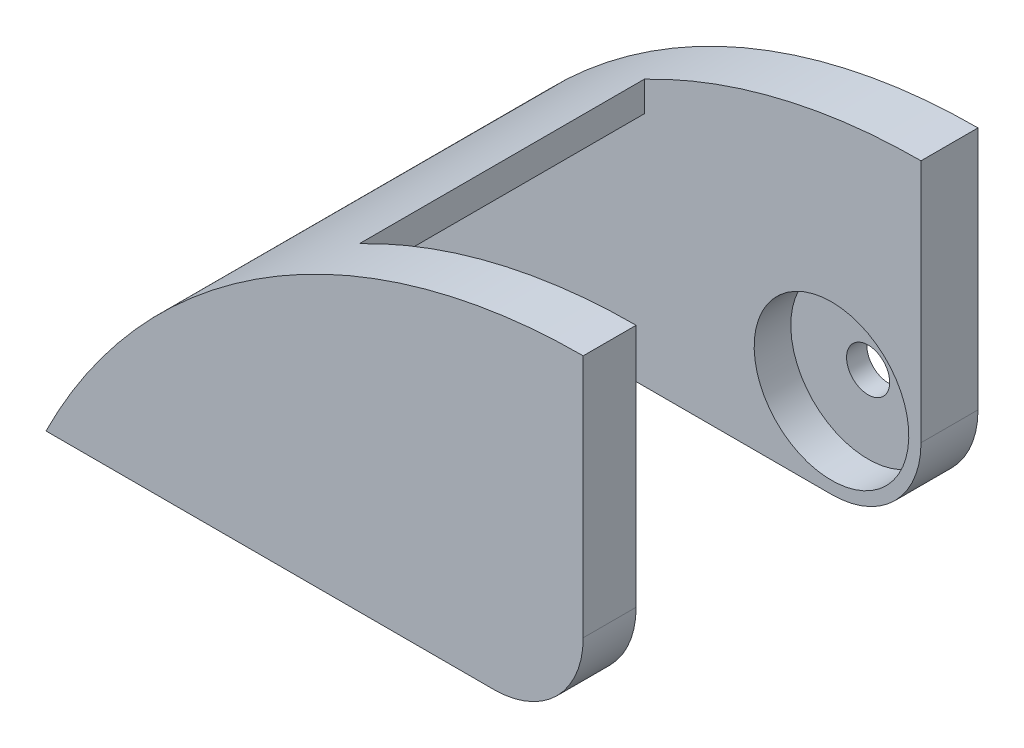
ISO-10303-21;
HEADER;
FILE_DESCRIPTION(('STEP AP214'),'2;1');
FILE_NAME('part.step','',(''),(''),'','','');
FILE_SCHEMA(('AUTOMOTIVE_DESIGN { 1 0 10303 214 1 1 1 1 }'));
ENDSEC;
DATA;
#1=APPLICATION_CONTEXT('core data for automotive mechanical design processes');
#2=APPLICATION_PROTOCOL_DEFINITION('international standard','automotive_design',2000,#1);
#3=PRODUCT_CONTEXT('',#1,'mechanical');
#4=PRODUCT('Part','Part','',(#3));
#5=PRODUCT_RELATED_PRODUCT_CATEGORY('part','',(#4));
#6=PRODUCT_DEFINITION_FORMATION('','',#4);
#7=PRODUCT_DEFINITION_CONTEXT('part definition',#1,'design');
#8=PRODUCT_DEFINITION('design','',#6,#7);
#9=PRODUCT_DEFINITION_SHAPE('','',#8);
#10=(LENGTH_UNIT() NAMED_UNIT(*) SI_UNIT(.MILLI.,.METRE.));
#11=(NAMED_UNIT(*) PLANE_ANGLE_UNIT() SI_UNIT($,.RADIAN.));
#12=(NAMED_UNIT(*) SI_UNIT($,.STERADIAN.) SOLID_ANGLE_UNIT());
#13=UNCERTAINTY_MEASURE_WITH_UNIT(LENGTH_MEASURE(1.E-05),#10,'distance_accuracy_value','');
#14=(GEOMETRIC_REPRESENTATION_CONTEXT(3) GLOBAL_UNCERTAINTY_ASSIGNED_CONTEXT((#13)) GLOBAL_UNIT_ASSIGNED_CONTEXT((#10,
#11,#12)) REPRESENTATION_CONTEXT('',''));
#15=CARTESIAN_POINT('',(0.,0.,0.));
#16=DIRECTION('',(0.,0.,1.));
#17=DIRECTION('',(1.,0.,0.));
#18=AXIS2_PLACEMENT_3D('',#15,#16,#17);
#19=CARTESIAN_POINT('',(0.,0.,-48.5));
#20=DIRECTION('',(0.,0.,-1.));
#21=DIRECTION('',(1.,0.,0.));
#22=AXIS2_PLACEMENT_3D('',#19,#20,#21);
#23=CYLINDRICAL_SURFACE('',#22,11.);
#24=DIRECTION('',(0.,0.,-1.));
#25=VECTOR('',#24,1.);
#26=CARTESIAN_POINT('',(11.,0.,-48.5));
#27=LINE('',#26,#25);
#28=CARTESIAN_POINT('',(11.,0.,-48.5));
#29=VERTEX_POINT('',#28);
#30=CARTESIAN_POINT('',(11.,0.,-55.));
#31=VERTEX_POINT('',#30);
#32=EDGE_CURVE('E161',#29,#31,#27,.T.);
#33=ORIENTED_EDGE('',*,*,#32,.F.);
#34=CARTESIAN_POINT('',(0.,0.,-48.5));
#35=DIRECTION('',(0.,0.,1.));
#36=DIRECTION('',(1.,0.,0.));
#37=AXIS2_PLACEMENT_3D('',#34,#35,#36);
#38=CIRCLE('',#37,11.);
#39=CARTESIAN_POINT('',(0.,-11.,-48.5));
#40=VERTEX_POINT('',#39);
#41=EDGE_CURVE('E233',#40,#29,#38,.T.);
#42=ORIENTED_EDGE('',*,*,#41,.F.);
#43=DIRECTION('',(0.,0.,1.));
#44=VECTOR('',#43,1.);
#45=CARTESIAN_POINT('',(0.,-11.,-55.5));
#46=LINE('',#45,#44);
#47=CARTESIAN_POINT('',(0.,-11.,-55.));
#48=VERTEX_POINT('',#47);
#49=EDGE_CURVE('E205',#48,#40,#46,.T.);
#50=ORIENTED_EDGE('',*,*,#49,.F.);
#51=CARTESIAN_POINT('',(0.,0.,-55.));
#52=DIRECTION('',(0.,0.,1.));
#53=DIRECTION('',(1.,0.,0.));
#54=AXIS2_PLACEMENT_3D('',#51,#52,#53);
#55=CIRCLE('',#54,11.);
#56=EDGE_CURVE('E177',#48,#31,#55,.T.);
#57=ORIENTED_EDGE('',*,*,#56,.T.);
#58=EDGE_LOOP('',(#33,#42,#50,#57));
#59=FACE_BOUND('',#58,.T.);
#60=ADVANCED_FACE('F49',(#59),#23,.T.);
#61=CARTESIAN_POINT('',(11.,0.,-48.5));
#62=DIRECTION('',(-1.,0.,0.));
#63=DIRECTION('',(0.,0.,-1.));
#64=AXIS2_PLACEMENT_3D('',#61,#62,#63);
#65=PLANE('',#64);
#66=DIRECTION('',(0.,1.,0.));
#67=VECTOR('',#66,1.);
#68=CARTESIAN_POINT('',(11.,0.,-55.));
#69=LINE('',#68,#67);
#70=CARTESIAN_POINT('',(11.,30.,-55.));
#71=VERTEX_POINT('',#70);
#72=EDGE_CURVE('E140',#31,#71,#69,.T.);
#73=ORIENTED_EDGE('',*,*,#72,.T.);
#74=DIRECTION('',(0.,0.,-1.));
#75=VECTOR('',#74,1.);
#76=CARTESIAN_POINT('',(11.,30.,-48.5));
#77=LINE('',#76,#75);
#78=CARTESIAN_POINT('',(11.,30.,-48.5));
#79=VERTEX_POINT('',#78);
#80=EDGE_CURVE('E149',#79,#71,#77,.T.);
#81=ORIENTED_EDGE('',*,*,#80,.F.);
#82=DIRECTION('',(0.,-1.,0.));
#83=VECTOR('',#82,1.);
#84=CARTESIAN_POINT('',(11.,0.,-48.5));
#85=LINE('',#84,#83);
#86=EDGE_CURVE('E230',#79,#29,#85,.T.);
#87=ORIENTED_EDGE('',*,*,#86,.T.);
#88=ORIENTED_EDGE('',*,*,#32,.T.);
#89=EDGE_LOOP('',(#73,#81,#87,#88));
#90=FACE_BOUND('',#89,.T.);
#91=ADVANCED_FACE('F159',(#90),#65,.F.);
#92=CARTESIAN_POINT('',(12.,-12.,-90.));
#93=DIRECTION('',(0.,0.,-1.));
#94=DIRECTION('',(0.,-1.,0.));
#95=AXIS2_PLACEMENT_3D('',#92,#93,#94);
#96=PLANE('',#95);
#97=CARTESIAN_POINT('',(0.,0.,-90.));
#98=DIRECTION('',(0.,0.,-1.));
#99=DIRECTION('',(0.,1.,0.));
#100=AXIS2_PLACEMENT_3D('',#97,#98,#99);
#101=CIRCLE('',#100,9.5);
#102=CARTESIAN_POINT('',(0.,9.5,-90.));
#103=VERTEX_POINT('',#102);
#104=EDGE_CURVE('E58',#103,#103,#101,.T.);
#105=ORIENTED_EDGE('',*,*,#104,.T.);
#106=EDGE_LOOP('',(#105));
#107=FACE_BOUND('',#106,.T.);
#108=CARTESIAN_POINT('',(11.,-43.6219512195122,-90.));
#109=DIRECTION('',(0.,0.,1.));
#110=DIRECTION('',(0.,-1.,0.));
#111=AXIS2_PLACEMENT_3D('',#108,#109,#110);
#112=CIRCLE('',#111,70.6219512195122);
#113=CARTESIAN_POINT('',(-23.499204656792,18.,-90.));
#114=VERTEX_POINT('',#113);
#115=CARTESIAN_POINT('',(-51.635998376995,-11.,-90.));
#116=VERTEX_POINT('',#115);
#117=EDGE_CURVE('E190',#114,#116,#112,.T.);
#118=ORIENTED_EDGE('',*,*,#117,.T.);
#119=DIRECTION('',(-1.,0.,0.));
#120=VECTOR('',#119,1.);
#121=CARTESIAN_POINT('',(0.,-11.,-90.));
#122=LINE('',#121,#120);
#123=CARTESIAN_POINT('',(0.,-11.,-90.));
#124=VERTEX_POINT('',#123);
#125=EDGE_CURVE('E209',#124,#116,#122,.T.);
#126=ORIENTED_EDGE('',*,*,#125,.F.);
#127=CARTESIAN_POINT('',(0.,0.,-90.));
#128=DIRECTION('',(0.,0.,1.));
#129=DIRECTION('',(0.,-1.,0.));
#130=AXIS2_PLACEMENT_3D('',#127,#128,#129);
#131=CIRCLE('',#130,11.);
#132=CARTESIAN_POINT('',(11.,0.,-90.));
#133=VERTEX_POINT('',#132);
#134=EDGE_CURVE('E155',#124,#133,#131,.T.);
#135=ORIENTED_EDGE('',*,*,#134,.T.);
#136=DIRECTION('',(0.,-1.,0.));
#137=VECTOR('',#136,1.);
#138=CARTESIAN_POINT('',(11.,-12.,-90.));
#139=LINE('',#138,#137);
#140=CARTESIAN_POINT('',(11.,30.,-90.));
#141=VERTEX_POINT('',#140);
#142=EDGE_CURVE('E248',#141,#133,#139,.T.);
#143=ORIENTED_EDGE('',*,*,#142,.F.);
#144=CARTESIAN_POINT('',(11.,-43.6219512195122,-90.));
#145=DIRECTION('',(0.,0.,1.));
#146=DIRECTION('',(0.,-1.,0.));
#147=AXIS2_PLACEMENT_3D('',#144,#145,#146);
#148=CIRCLE('',#147,73.6219512195122);
#149=CARTESIAN_POINT('',(-23.,21.6788274999505,-90.));
#150=VERTEX_POINT('',#149);
#151=EDGE_CURVE('E197',#150,#141,#148,.F.);
#152=ORIENTED_EDGE('',*,*,#151,.F.);
#153=DIRECTION('',(0.,1.,0.));
#154=VECTOR('',#153,1.);
#155=CARTESIAN_POINT('',(-23.,15.5,-90.));
#156=LINE('',#155,#154);
#157=CARTESIAN_POINT('',(-23.,18.,-90.));
#158=VERTEX_POINT('',#157);
#159=EDGE_CURVE('E252',#158,#150,#156,.T.);
#160=ORIENTED_EDGE('',*,*,#159,.F.);
#161=DIRECTION('',(1.,0.,0.));
#162=VECTOR('',#161,1.);
#163=CARTESIAN_POINT('',(0.,18.,-90.));
#164=LINE('',#163,#162);
#165=EDGE_CURVE('E213',#114,#158,#164,.T.);
#166=ORIENTED_EDGE('',*,*,#165,.F.);
#167=EDGE_LOOP('',(#118,#126,#135,#143,#152,#160,#166));
#168=FACE_BOUND('',#167,.T.);
#169=ADVANCED_FACE('F297',(#107,#168),#96,.F.);
#170=CARTESIAN_POINT('',(12.,18.,-90.));
#171=DIRECTION('',(0.,1.,0.));
#172=DIRECTION('',(0.,0.,-1.));
#173=AXIS2_PLACEMENT_3D('',#170,#171,#172);
#174=PLANE('',#173);
#175=DIRECTION('',(0.,0.,-1.));
#176=VECTOR('',#175,1.);
#177=CARTESIAN_POINT('',(-23.499204656792,18.,-55.5));
#178=LINE('',#177,#176);
#179=CARTESIAN_POINT('',(-23.499204656792,18.,-55.));
#180=VERTEX_POINT('',#179);
#181=EDGE_CURVE('E187',#180,#114,#178,.T.);
#182=ORIENTED_EDGE('',*,*,#181,.T.);
#183=ORIENTED_EDGE('',*,*,#165,.T.);
#184=DIRECTION('',(0.,0.,-1.));
#185=VECTOR('',#184,1.);
#186=CARTESIAN_POINT('',(-23.,18.,-90.));
#187=LINE('',#186,#185);
#188=CARTESIAN_POINT('',(-23.,18.,-55.));
#189=VERTEX_POINT('',#188);
#190=EDGE_CURVE('E11',#189,#158,#187,.T.);
#191=ORIENTED_EDGE('',*,*,#190,.F.);
#192=DIRECTION('',(-1.,0.,0.));
#193=VECTOR('',#192,1.);
#194=CARTESIAN_POINT('',(0.,18.,-55.));
#195=LINE('',#194,#193);
#196=EDGE_CURVE('E167',#189,#180,#195,.T.);
#197=ORIENTED_EDGE('',*,*,#196,.T.);
#198=EDGE_LOOP('',(#182,#183,#191,#197));
#199=FACE_BOUND('',#198,.T.);
#200=ADVANCED_FACE('F320',(#199),#174,.F.);
#201=CARTESIAN_POINT('',(0.,0.,-97.));
#202=DIRECTION('',(0.,0.,-1.));
#203=DIRECTION('',(1.,0.,0.));
#204=AXIS2_PLACEMENT_3D('',#201,#202,#203);
#205=PLANE('',#204);
#206=CARTESIAN_POINT('',(11.,-43.6219512195122,-97.));
#207=DIRECTION('',(0.,0.,1.));
#208=DIRECTION('',(1.,0.,0.));
#209=AXIS2_PLACEMENT_3D('',#206,#207,#208);
#210=CIRCLE('',#209,73.6219512195122);
#211=CARTESIAN_POINT('',(-55.,-11.,-97.));
#212=VERTEX_POINT('',#211);
#213=CARTESIAN_POINT('',(11.,30.,-97.));
#214=VERTEX_POINT('',#213);
#215=EDGE_CURVE('E208',#212,#214,#210,.F.);
#216=ORIENTED_EDGE('',*,*,#215,.T.);
#217=DIRECTION('',(0.,-1.,0.));
#218=VECTOR('',#217,1.);
#219=CARTESIAN_POINT('',(11.,0.,-97.));
#220=LINE('',#219,#218);
#221=CARTESIAN_POINT('',(11.,0.,-97.));
#222=VERTEX_POINT('',#221);
#223=EDGE_CURVE('E227',#214,#222,#220,.T.);
#224=ORIENTED_EDGE('',*,*,#223,.T.);
#225=CARTESIAN_POINT('',(0.,0.,-97.));
#226=DIRECTION('',(0.,0.,1.));
#227=DIRECTION('',(1.,0.,0.));
#228=AXIS2_PLACEMENT_3D('',#225,#226,#227);
#229=CIRCLE('',#228,11.);
#230=CARTESIAN_POINT('',(0.,-11.,-97.));
#231=VERTEX_POINT('',#230);
#232=EDGE_CURVE('E234',#231,#222,#229,.T.);
#233=ORIENTED_EDGE('',*,*,#232,.F.);
#234=DIRECTION('',(-1.,0.,0.));
#235=VECTOR('',#234,1.);
#236=CARTESIAN_POINT('',(0.,-11.,-97.));
#237=LINE('',#236,#235);
#238=EDGE_CURVE('E214',#231,#212,#237,.T.);
#239=ORIENTED_EDGE('',*,*,#238,.T.);
#240=EDGE_LOOP('',(#216,#224,#233,#239));
#241=FACE_BOUND('',#240,.T.);
#242=CARTESIAN_POINT('',(0.,0.,-97.));
#243=DIRECTION('',(0.,0.,1.));
#244=DIRECTION('',(1.,0.,0.));
#245=AXIS2_PLACEMENT_3D('',#242,#243,#244);
#246=CIRCLE('',#245,2.65);
#247=CARTESIAN_POINT('',(2.65,0.,-97.));
#248=VERTEX_POINT('',#247);
#249=EDGE_CURVE('E260',#248,#248,#246,.T.);
#250=ORIENTED_EDGE('',*,*,#249,.T.);
#251=EDGE_LOOP('',(#250));
#252=FACE_BOUND('',#251,.T.);
#253=ADVANCED_FACE('F305',(#241,#252),#205,.T.);
#254=CARTESIAN_POINT('',(0.,0.,-48.5));
#255=DIRECTION('',(0.,0.,1.));
#256=DIRECTION('',(-1.,0.,0.));
#257=AXIS2_PLACEMENT_3D('',#254,#255,#256);
#258=PLANE('',#257);
#259=CARTESIAN_POINT('',(11.,-43.6219512195122,-48.5));
#260=DIRECTION('',(0.,0.,1.));
#261=DIRECTION('',(1.,0.,0.));
#262=AXIS2_PLACEMENT_3D('',#259,#260,#261);
#263=CIRCLE('',#262,73.6219512195122);
#264=CARTESIAN_POINT('',(-55.,-11.,-48.5));
#265=VERTEX_POINT('',#264);
#266=EDGE_CURVE('E151',#265,#79,#263,.F.);
#267=ORIENTED_EDGE('',*,*,#266,.F.);
#268=DIRECTION('',(-1.,0.,0.));
#269=VECTOR('',#268,1.);
#270=CARTESIAN_POINT('',(0.,-11.,-48.5));
#271=LINE('',#270,#269);
#272=EDGE_CURVE('E65',#40,#265,#271,.T.);
#273=ORIENTED_EDGE('',*,*,#272,.F.);
#274=ORIENTED_EDGE('',*,*,#41,.T.);
#275=ORIENTED_EDGE('',*,*,#86,.F.);
#276=EDGE_LOOP('',(#267,#273,#274,#275));
#277=FACE_BOUND('',#276,.T.);
#278=ADVANCED_FACE('F289',(#277),#258,.T.);
#279=ORIENTED_EDGE('',*,*,#232,.T.);
#280=EDGE_CURVE('E237',#133,#222,#27,.T.);
#281=ORIENTED_EDGE('',*,*,#280,.F.);
#282=ORIENTED_EDGE('',*,*,#134,.F.);
#283=DIRECTION('',(0.,0.,-1.));
#284=VECTOR('',#283,1.);
#285=CARTESIAN_POINT('',(0.,-11.,-90.));
#286=LINE('',#285,#284);
#287=EDGE_CURVE('E73',#124,#231,#286,.T.);
#288=ORIENTED_EDGE('',*,*,#287,.T.);
#289=EDGE_LOOP('',(#279,#281,#282,#288));
#290=FACE_BOUND('',#289,.T.);
#291=ADVANCED_FACE('F284',(#290),#23,.T.);
#292=CARTESIAN_POINT('',(0.,0.,-49.));
#293=DIRECTION('',(0.,0.,-1.));
#294=DIRECTION('',(1.,0.,0.));
#295=AXIS2_PLACEMENT_3D('',#292,#293,#294);
#296=CYLINDRICAL_SURFACE('',#295,2.65);
#297=ORIENTED_EDGE('',*,*,#249,.F.);
#298=EDGE_LOOP('',(#297));
#299=FACE_BOUND('',#298,.T.);
#300=CARTESIAN_POINT('',(0.,0.,-94.5));
#301=DIRECTION('',(0.,0.,-1.));
#302=DIRECTION('',(0.,1.,0.));
#303=AXIS2_PLACEMENT_3D('',#300,#301,#302);
#304=CIRCLE('',#303,2.65);
#305=CARTESIAN_POINT('',(0.,2.65,-94.5));
#306=VERTEX_POINT('',#305);
#307=EDGE_CURVE('E261',#306,#306,#304,.F.);
#308=ORIENTED_EDGE('',*,*,#307,.T.);
#309=EDGE_LOOP('',(#308));
#310=FACE_BOUND('',#309,.T.);
#311=ADVANCED_FACE('F51',(#299,#310),#296,.F.);
#312=CARTESIAN_POINT('',(0.,0.,-94.5));
#313=DIRECTION('',(0.,0.,1.));
#314=DIRECTION('',(0.,1.,0.));
#315=AXIS2_PLACEMENT_3D('',#312,#313,#314);
#316=PLANE('',#315);
#317=CARTESIAN_POINT('',(0.,0.,-94.5));
#318=DIRECTION('',(0.,0.,-1.));
#319=DIRECTION('',(0.,1.,0.));
#320=AXIS2_PLACEMENT_3D('',#317,#318,#319);
#321=CIRCLE('',#320,9.5);
#322=CARTESIAN_POINT('',(0.,9.5,-94.5));
#323=VERTEX_POINT('',#322);
#324=EDGE_CURVE('E265',#323,#323,#321,.T.);
#325=ORIENTED_EDGE('',*,*,#324,.F.);
#326=EDGE_LOOP('',(#325));
#327=FACE_BOUND('',#326,.T.);
#328=ORIENTED_EDGE('',*,*,#307,.F.);
#329=EDGE_LOOP('',(#328));
#330=FACE_BOUND('',#329,.T.);
#331=ADVANCED_FACE('F278',(#327,#330),#316,.T.);
#332=CARTESIAN_POINT('',(0.,0.,-94.5));
#333=DIRECTION('',(0.,0.,1.));
#334=DIRECTION('',(0.,1.,0.));
#335=AXIS2_PLACEMENT_3D('',#332,#333,#334);
#336=CYLINDRICAL_SURFACE('',#335,9.5);
#337=ORIENTED_EDGE('',*,*,#324,.T.);
#338=EDGE_LOOP('',(#337));
#339=FACE_BOUND('',#338,.T.);
#340=ORIENTED_EDGE('',*,*,#104,.F.);
#341=EDGE_LOOP('',(#340));
#342=FACE_BOUND('',#341,.T.);
#343=ADVANCED_FACE('F275',(#339,#342),#336,.F.);
#344=CARTESIAN_POINT('',(-23.,15.5,-56.));
#345=DIRECTION('',(-1.,0.,0.));
#346=DIRECTION('',(0.,0.,-1.));
#347=AXIS2_PLACEMENT_3D('',#344,#345,#346);
#348=PLANE('',#347);
#349=DIRECTION('',(0.,0.,-1.));
#350=VECTOR('',#349,1.);
#351=CARTESIAN_POINT('',(-23.,21.6788274999505,-48.5));
#352=LINE('',#351,#350);
#353=CARTESIAN_POINT('',(-23.,21.6788274999505,-55.));
#354=VERTEX_POINT('',#353);
#355=EDGE_CURVE('E194',#354,#150,#352,.T.);
#356=ORIENTED_EDGE('',*,*,#355,.F.);
#357=DIRECTION('',(0.,-1.,0.));
#358=VECTOR('',#357,1.);
#359=CARTESIAN_POINT('',(-23.,0.,-55.));
#360=LINE('',#359,#358);
#361=EDGE_CURVE('E143',#354,#189,#360,.T.);
#362=ORIENTED_EDGE('',*,*,#361,.T.);
#363=ORIENTED_EDGE('',*,*,#190,.T.);
#364=ORIENTED_EDGE('',*,*,#159,.T.);
#365=EDGE_LOOP('',(#356,#362,#363,#364));
#366=FACE_BOUND('',#365,.T.);
#367=ADVANCED_FACE('F306',(#366),#348,.F.);
#368=EDGE_CURVE('E156',#141,#214,#77,.T.);
#369=ORIENTED_EDGE('',*,*,#368,.F.);
#370=ORIENTED_EDGE('',*,*,#142,.T.);
#371=ORIENTED_EDGE('',*,*,#280,.T.);
#372=ORIENTED_EDGE('',*,*,#223,.F.);
#373=EDGE_LOOP('',(#369,#370,#371,#372));
#374=FACE_BOUND('',#373,.T.);
#375=ADVANCED_FACE('F299',(#374),#65,.F.);
#376=CARTESIAN_POINT('',(11.,-43.6219512195122,-90.));
#377=DIRECTION('',(0.,0.,-1.));
#378=DIRECTION('',(1.,0.,0.));
#379=AXIS2_PLACEMENT_3D('',#376,#377,#378);
#380=CYLINDRICAL_SURFACE('',#379,73.6219512195122);
#381=ORIENTED_EDGE('',*,*,#355,.T.);
#382=ORIENTED_EDGE('',*,*,#151,.T.);
#383=ORIENTED_EDGE('',*,*,#368,.T.);
#384=ORIENTED_EDGE('',*,*,#215,.F.);
#385=DIRECTION('',(0.,0.,-1.));
#386=VECTOR('',#385,1.);
#387=CARTESIAN_POINT('',(-55.,-11.,-90.));
#388=LINE('',#387,#386);
#389=EDGE_CURVE('E218',#265,#212,#388,.T.);
#390=ORIENTED_EDGE('',*,*,#389,.F.);
#391=ORIENTED_EDGE('',*,*,#266,.T.);
#392=ORIENTED_EDGE('',*,*,#80,.T.);
#393=CARTESIAN_POINT('',(11.,-43.6219512195122,-55.));
#394=DIRECTION('',(0.,0.,1.));
#395=DIRECTION('',(1.,0.,0.));
#396=AXIS2_PLACEMENT_3D('',#393,#394,#395);
#397=CIRCLE('',#396,73.6219512195122);
#398=EDGE_CURVE('E134',#71,#354,#397,.T.);
#399=ORIENTED_EDGE('',*,*,#398,.T.);
#400=EDGE_LOOP('',(#381,#382,#383,#384,#390,#391,#392,#399));
#401=FACE_BOUND('',#400,.T.);
#402=ADVANCED_FACE('F150',(#401),#380,.T.);
#403=CARTESIAN_POINT('',(0.,-11.,-90.));
#404=DIRECTION('',(0.,1.,0.));
#405=DIRECTION('',(-1.,0.,0.));
#406=AXIS2_PLACEMENT_3D('',#403,#404,#405);
#407=PLANE('',#406);
#408=DIRECTION('',(1.,0.,0.));
#409=VECTOR('',#408,1.);
#410=CARTESIAN_POINT('',(0.,-11.,-55.));
#411=LINE('',#410,#409);
#412=CARTESIAN_POINT('',(-51.635998376995,-11.,-55.));
#413=VERTEX_POINT('',#412);
#414=EDGE_CURVE('E174',#413,#48,#411,.T.);
#415=ORIENTED_EDGE('',*,*,#414,.T.);
#416=ORIENTED_EDGE('',*,*,#49,.T.);
#417=ORIENTED_EDGE('',*,*,#272,.T.);
#418=ORIENTED_EDGE('',*,*,#389,.T.);
#419=ORIENTED_EDGE('',*,*,#238,.F.);
#420=ORIENTED_EDGE('',*,*,#287,.F.);
#421=ORIENTED_EDGE('',*,*,#125,.T.);
#422=DIRECTION('',(0.,0.,-1.));
#423=VECTOR('',#422,1.);
#424=CARTESIAN_POINT('',(-51.635998376995,-11.,-55.5));
#425=LINE('',#424,#423);
#426=EDGE_CURVE('E184',#413,#116,#425,.T.);
#427=ORIENTED_EDGE('',*,*,#426,.F.);
#428=EDGE_LOOP('',(#415,#416,#417,#418,#419,#420,#421,#427));
#429=FACE_BOUND('',#428,.T.);
#430=ADVANCED_FACE('F354',(#429),#407,.F.);
#431=CARTESIAN_POINT('',(11.,-43.6219512195122,-55.5));
#432=DIRECTION('',(0.,0.,-1.));
#433=DIRECTION('',(1.,0.,0.));
#434=AXIS2_PLACEMENT_3D('',#431,#432,#433);
#435=CYLINDRICAL_SURFACE('',#434,70.6219512195122);
#436=ORIENTED_EDGE('',*,*,#181,.F.);
#437=CARTESIAN_POINT('',(11.,-43.6219512195122,-55.));
#438=DIRECTION('',(0.,0.,1.));
#439=DIRECTION('',(1.,0.,0.));
#440=AXIS2_PLACEMENT_3D('',#437,#438,#439);
#441=CIRCLE('',#440,70.6219512195122);
#442=EDGE_CURVE('E171',#180,#413,#441,.T.);
#443=ORIENTED_EDGE('',*,*,#442,.T.);
#444=ORIENTED_EDGE('',*,*,#426,.T.);
#445=ORIENTED_EDGE('',*,*,#117,.F.);
#446=EDGE_LOOP('',(#436,#443,#444,#445));
#447=FACE_BOUND('',#446,.T.);
#448=ADVANCED_FACE('F362',(#447),#435,.F.);
#449=CARTESIAN_POINT('',(0.,0.,-55.));
#450=DIRECTION('',(0.,0.,-1.));
#451=DIRECTION('',(1.,0.,0.));
#452=AXIS2_PLACEMENT_3D('',#449,#450,#451);
#453=PLANE('',#452);
#454=ORIENTED_EDGE('',*,*,#72,.F.);
#455=ORIENTED_EDGE('',*,*,#56,.F.);
#456=ORIENTED_EDGE('',*,*,#414,.F.);
#457=ORIENTED_EDGE('',*,*,#442,.F.);
#458=ORIENTED_EDGE('',*,*,#196,.F.);
#459=ORIENTED_EDGE('',*,*,#361,.F.);
#460=ORIENTED_EDGE('',*,*,#398,.F.);
#461=EDGE_LOOP('',(#454,#455,#456,#457,#458,#459,#460));
#462=FACE_BOUND('',#461,.T.);
#463=CARTESIAN_POINT('',(0.,0.,-55.));
#464=DIRECTION('',(0.,0.,1.));
#465=DIRECTION('',(1.,0.,0.));
#466=AXIS2_PLACEMENT_3D('',#463,#464,#465);
#467=CIRCLE('',#466,4.2);
#468=CARTESIAN_POINT('',(4.2,0.,-55.));
#469=VERTEX_POINT('',#468);
#470=EDGE_CURVE('E180',#469,#469,#467,.F.);
#471=ORIENTED_EDGE('',*,*,#470,.F.);
#472=EDGE_LOOP('',(#471));
#473=FACE_BOUND('',#472,.T.);
#474=ADVANCED_FACE('F136',(#462,#473),#453,.T.);
#475=CARTESIAN_POINT('',(0.,0.,-59.5));
#476=DIRECTION('',(0.,0.,-1.));
#477=DIRECTION('',(1.,0.,0.));
#478=AXIS2_PLACEMENT_3D('',#475,#476,#477);
#479=PLANE('',#478);
#480=CARTESIAN_POINT('',(0.,0.,-59.5));
#481=DIRECTION('',(0.,0.,1.));
#482=DIRECTION('',(1.,0.,0.));
#483=AXIS2_PLACEMENT_3D('',#480,#481,#482);
#484=CIRCLE('',#483,4.2);
#485=CARTESIAN_POINT('',(4.2,0.,-59.5));
#486=VERTEX_POINT('',#485);
#487=EDGE_CURVE('E256',#486,#486,#484,.T.);
#488=ORIENTED_EDGE('',*,*,#487,.F.);
#489=EDGE_LOOP('',(#488));
#490=FACE_BOUND('',#489,.T.);
#491=ADVANCED_FACE('F310',(#490),#479,.T.);
#492=CARTESIAN_POINT('',(0.,0.,-59.5));
#493=DIRECTION('',(0.,0.,1.));
#494=DIRECTION('',(-1.,0.,0.));
#495=AXIS2_PLACEMENT_3D('',#492,#493,#494);
#496=CYLINDRICAL_SURFACE('',#495,4.2);
#497=ORIENTED_EDGE('',*,*,#487,.T.);
#498=EDGE_LOOP('',(#497));
#499=FACE_BOUND('',#498,.T.);
#500=ORIENTED_EDGE('',*,*,#470,.T.);
#501=EDGE_LOOP('',(#500));
#502=FACE_BOUND('',#501,.T.);
#503=ADVANCED_FACE('F313',(#499,#502),#496,.T.);
#504=CLOSED_SHELL('',(#60,#91,#169,#200,#253,#278,#291,#311,#331,#343,#367,#375,#402,#430,#448,
#474,#491,#503));
#505=MANIFOLD_SOLID_BREP('B2',#504);
#506=ADVANCED_BREP_SHAPE_REPRESENTATION('',(#18,#505),#14);
#507=SHAPE_DEFINITION_REPRESENTATION(#9,#506);
ENDSEC;
END-ISO-10303-21;
